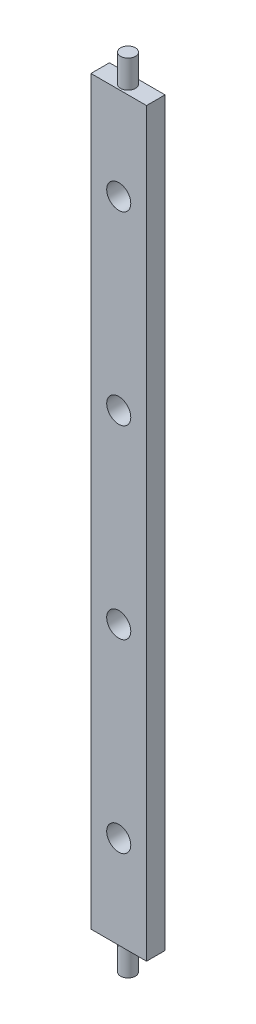
ISO-10303-21;
HEADER;
FILE_DESCRIPTION(('STEP AP214'),'2;1');
FILE_NAME('part.step','',(''),(''),'','','');
FILE_SCHEMA(('AUTOMOTIVE_DESIGN { 1 0 10303 214 1 1 1 1 }'));
ENDSEC;
DATA;
#1=APPLICATION_CONTEXT('core data for automotive mechanical design processes');
#2=APPLICATION_PROTOCOL_DEFINITION('international standard','automotive_design',2000,#1);
#3=PRODUCT_CONTEXT('',#1,'mechanical');
#4=PRODUCT('Part','Part','',(#3));
#5=PRODUCT_RELATED_PRODUCT_CATEGORY('part','',(#4));
#6=PRODUCT_DEFINITION_FORMATION('','',#4);
#7=PRODUCT_DEFINITION_CONTEXT('part definition',#1,'design');
#8=PRODUCT_DEFINITION('design','',#6,#7);
#9=PRODUCT_DEFINITION_SHAPE('','',#8);
#10=(LENGTH_UNIT() NAMED_UNIT(*) SI_UNIT(.MILLI.,.METRE.));
#11=(NAMED_UNIT(*) PLANE_ANGLE_UNIT() SI_UNIT($,.RADIAN.));
#12=(NAMED_UNIT(*) SI_UNIT($,.STERADIAN.) SOLID_ANGLE_UNIT());
#13=UNCERTAINTY_MEASURE_WITH_UNIT(LENGTH_MEASURE(1.E-05),#10,'distance_accuracy_value','');
#14=(GEOMETRIC_REPRESENTATION_CONTEXT(3) GLOBAL_UNCERTAINTY_ASSIGNED_CONTEXT((#13)) GLOBAL_UNIT_ASSIGNED_CONTEXT((#10,
#11,#12)) REPRESENTATION_CONTEXT('',''));
#15=CARTESIAN_POINT('',(0.,0.,0.));
#16=DIRECTION('',(0.,0.,1.));
#17=DIRECTION('',(1.,0.,0.));
#18=AXIS2_PLACEMENT_3D('',#15,#16,#17);
#19=CARTESIAN_POINT('',(3.,-40.,2.));
#20=DIRECTION('',(-1.,0.,0.));
#21=DIRECTION('',(0.,0.,1.));
#22=AXIS2_PLACEMENT_3D('',#19,#20,#21);
#23=PLANE('',#22);
#24=DIRECTION('',(0.,1.,0.));
#25=VECTOR('',#24,1.);
#26=CARTESIAN_POINT('',(3.,-40.,0.));
#27=LINE('',#26,#25);
#28=CARTESIAN_POINT('',(3.,-40.,0.));
#29=VERTEX_POINT('',#28);
#30=CARTESIAN_POINT('',(3.,40.,0.));
#31=VERTEX_POINT('',#30);
#32=EDGE_CURVE('E108',#29,#31,#27,.T.);
#33=ORIENTED_EDGE('',*,*,#32,.T.);
#34=DIRECTION('',(0.,0.,-1.));
#35=VECTOR('',#34,1.);
#36=CARTESIAN_POINT('',(3.,40.,2.));
#37=LINE('',#36,#35);
#38=CARTESIAN_POINT('',(3.,40.,2.));
#39=VERTEX_POINT('',#38);
#40=EDGE_CURVE('E99',#39,#31,#37,.T.);
#41=ORIENTED_EDGE('',*,*,#40,.F.);
#42=DIRECTION('',(0.,1.,0.));
#43=VECTOR('',#42,1.);
#44=CARTESIAN_POINT('',(3.,-40.,2.));
#45=LINE('',#44,#43);
#46=CARTESIAN_POINT('',(3.,-40.,2.));
#47=VERTEX_POINT('',#46);
#48=EDGE_CURVE('E93',#47,#39,#45,.T.);
#49=ORIENTED_EDGE('',*,*,#48,.F.);
#50=DIRECTION('',(0.,0.,-1.));
#51=VECTOR('',#50,1.);
#52=CARTESIAN_POINT('',(3.,-40.,2.));
#53=LINE('',#52,#51);
#54=EDGE_CURVE('E104',#47,#29,#53,.T.);
#55=ORIENTED_EDGE('',*,*,#54,.T.);
#56=EDGE_LOOP('',(#33,#41,#49,#55));
#57=FACE_BOUND('',#56,.T.);
#58=ADVANCED_FACE('F39',(#57),#23,.F.);
#59=CARTESIAN_POINT('',(-3.,40.,2.));
#60=DIRECTION('',(0.,-1.,0.));
#61=DIRECTION('',(0.,0.,-1.));
#62=AXIS2_PLACEMENT_3D('',#59,#60,#61);
#63=PLANE('',#62);
#64=CARTESIAN_POINT('',(0.,40.,1.));
#65=DIRECTION('',(0.,1.,0.));
#66=DIRECTION('',(0.,0.,1.));
#67=AXIS2_PLACEMENT_3D('',#64,#65,#66);
#68=CIRCLE('',#67,0.8);
#69=CARTESIAN_POINT('',(0.,40.,1.8));
#70=VERTEX_POINT('',#69);
#71=EDGE_CURVE('E48',#70,#70,#68,.T.);
#72=ORIENTED_EDGE('',*,*,#71,.F.);
#73=EDGE_LOOP('',(#72));
#74=FACE_BOUND('',#73,.T.);
#75=DIRECTION('',(-1.,0.,0.));
#76=VECTOR('',#75,1.);
#77=CARTESIAN_POINT('',(-3.,40.,0.));
#78=LINE('',#77,#76);
#79=CARTESIAN_POINT('',(-3.,40.,0.));
#80=VERTEX_POINT('',#79);
#81=EDGE_CURVE('E98',#31,#80,#78,.T.);
#82=ORIENTED_EDGE('',*,*,#81,.T.);
#83=DIRECTION('',(0.,0.,-1.));
#84=VECTOR('',#83,1.);
#85=CARTESIAN_POINT('',(-3.,40.,2.));
#86=LINE('',#85,#84);
#87=CARTESIAN_POINT('',(-3.,40.,2.));
#88=VERTEX_POINT('',#87);
#89=EDGE_CURVE('E96',#88,#80,#86,.T.);
#90=ORIENTED_EDGE('',*,*,#89,.F.);
#91=DIRECTION('',(-1.,0.,0.));
#92=VECTOR('',#91,1.);
#93=CARTESIAN_POINT('',(-3.,40.,2.));
#94=LINE('',#93,#92);
#95=EDGE_CURVE('E88',#39,#88,#94,.T.);
#96=ORIENTED_EDGE('',*,*,#95,.F.);
#97=ORIENTED_EDGE('',*,*,#40,.T.);
#98=EDGE_LOOP('',(#82,#90,#96,#97));
#99=FACE_BOUND('',#98,.T.);
#100=ADVANCED_FACE('F97',(#74,#99),#63,.F.);
#101=CARTESIAN_POINT('',(-3.,-40.,2.));
#102=DIRECTION('',(1.,0.,0.));
#103=DIRECTION('',(0.,0.,-1.));
#104=AXIS2_PLACEMENT_3D('',#101,#102,#103);
#105=PLANE('',#104);
#106=DIRECTION('',(0.,-1.,0.));
#107=VECTOR('',#106,1.);
#108=CARTESIAN_POINT('',(-3.,-40.,0.));
#109=LINE('',#108,#107);
#110=CARTESIAN_POINT('',(-3.,-40.,0.));
#111=VERTEX_POINT('',#110);
#112=EDGE_CURVE('E74',#80,#111,#109,.T.);
#113=ORIENTED_EDGE('',*,*,#112,.T.);
#114=DIRECTION('',(0.,0.,-1.));
#115=VECTOR('',#114,1.);
#116=CARTESIAN_POINT('',(-3.,-40.,2.));
#117=LINE('',#116,#115);
#118=CARTESIAN_POINT('',(-3.,-40.,2.));
#119=VERTEX_POINT('',#118);
#120=EDGE_CURVE('E100',#119,#111,#117,.T.);
#121=ORIENTED_EDGE('',*,*,#120,.F.);
#122=DIRECTION('',(0.,-1.,0.));
#123=VECTOR('',#122,1.);
#124=CARTESIAN_POINT('',(-3.,-40.,2.));
#125=LINE('',#124,#123);
#126=EDGE_CURVE('E91',#88,#119,#125,.T.);
#127=ORIENTED_EDGE('',*,*,#126,.F.);
#128=ORIENTED_EDGE('',*,*,#89,.T.);
#129=EDGE_LOOP('',(#113,#121,#127,#128));
#130=FACE_BOUND('',#129,.T.);
#131=ADVANCED_FACE('F102',(#130),#105,.F.);
#132=CARTESIAN_POINT('',(-3.,-40.,2.));
#133=DIRECTION('',(0.,1.,0.));
#134=DIRECTION('',(0.,0.,1.));
#135=AXIS2_PLACEMENT_3D('',#132,#133,#134);
#136=PLANE('',#135);
#137=CARTESIAN_POINT('',(0.,-40.,1.));
#138=DIRECTION('',(0.,-1.,0.));
#139=DIRECTION('',(0.,0.,-1.));
#140=AXIS2_PLACEMENT_3D('',#137,#138,#139);
#141=CIRCLE('',#140,0.8);
#142=CARTESIAN_POINT('',(0.,-40.,0.2));
#143=VERTEX_POINT('',#142);
#144=EDGE_CURVE('E11',#143,#143,#141,.T.);
#145=ORIENTED_EDGE('',*,*,#144,.F.);
#146=EDGE_LOOP('',(#145));
#147=FACE_BOUND('',#146,.T.);
#148=DIRECTION('',(1.,0.,0.));
#149=VECTOR('',#148,1.);
#150=CARTESIAN_POINT('',(-3.,-40.,0.));
#151=LINE('',#150,#149);
#152=EDGE_CURVE('E80',#111,#29,#151,.T.);
#153=ORIENTED_EDGE('',*,*,#152,.T.);
#154=ORIENTED_EDGE('',*,*,#54,.F.);
#155=DIRECTION('',(1.,0.,0.));
#156=VECTOR('',#155,1.);
#157=CARTESIAN_POINT('',(-3.,-40.,2.));
#158=LINE('',#157,#156);
#159=EDGE_CURVE('E57',#119,#47,#158,.T.);
#160=ORIENTED_EDGE('',*,*,#159,.F.);
#161=ORIENTED_EDGE('',*,*,#120,.T.);
#162=EDGE_LOOP('',(#153,#154,#160,#161));
#163=FACE_BOUND('',#162,.T.);
#164=ADVANCED_FACE('F145',(#147,#163),#136,.F.);
#165=CARTESIAN_POINT('',(0.,0.,2.));
#166=DIRECTION('',(0.,0.,-1.));
#167=DIRECTION('',(-1.,0.,0.));
#168=AXIS2_PLACEMENT_3D('',#165,#166,#167);
#169=PLANE('',#168);
#170=CARTESIAN_POINT('',(0.,-30.,2.));
#171=DIRECTION('',(0.,0.,1.));
#172=DIRECTION('',(1.,0.,0.));
#173=AXIS2_PLACEMENT_3D('',#170,#171,#172);
#174=CIRCLE('',#173,1.3);
#175=CARTESIAN_POINT('',(1.3,-30.,2.));
#176=VERTEX_POINT('',#175);
#177=EDGE_CURVE('E121',#176,#176,#174,.T.);
#178=ORIENTED_EDGE('',*,*,#177,.F.);
#179=EDGE_LOOP('',(#178));
#180=FACE_BOUND('',#179,.T.);
#181=CARTESIAN_POINT('',(0.,-10.,2.));
#182=DIRECTION('',(0.,0.,1.));
#183=DIRECTION('',(1.,0.,0.));
#184=AXIS2_PLACEMENT_3D('',#181,#182,#183);
#185=CIRCLE('',#184,1.3);
#186=CARTESIAN_POINT('',(1.3,-10.,2.));
#187=VERTEX_POINT('',#186);
#188=EDGE_CURVE('E177',#187,#187,#185,.T.);
#189=ORIENTED_EDGE('',*,*,#188,.F.);
#190=EDGE_LOOP('',(#189));
#191=FACE_BOUND('',#190,.T.);
#192=CARTESIAN_POINT('',(0.,10.,2.));
#193=DIRECTION('',(0.,0.,1.));
#194=DIRECTION('',(1.,0.,0.));
#195=AXIS2_PLACEMENT_3D('',#192,#193,#194);
#196=CIRCLE('',#195,1.3);
#197=CARTESIAN_POINT('',(1.3,10.,2.));
#198=VERTEX_POINT('',#197);
#199=EDGE_CURVE('E180',#198,#198,#196,.T.);
#200=ORIENTED_EDGE('',*,*,#199,.F.);
#201=EDGE_LOOP('',(#200));
#202=FACE_BOUND('',#201,.T.);
#203=CARTESIAN_POINT('',(0.,30.,2.));
#204=DIRECTION('',(0.,0.,1.));
#205=DIRECTION('',(1.,0.,0.));
#206=AXIS2_PLACEMENT_3D('',#203,#204,#205);
#207=CIRCLE('',#206,1.3);
#208=CARTESIAN_POINT('',(1.3,30.,2.));
#209=VERTEX_POINT('',#208);
#210=EDGE_CURVE('E183',#209,#209,#207,.T.);
#211=ORIENTED_EDGE('',*,*,#210,.F.);
#212=EDGE_LOOP('',(#211));
#213=FACE_BOUND('',#212,.T.);
#214=ORIENTED_EDGE('',*,*,#48,.T.);
#215=ORIENTED_EDGE('',*,*,#95,.T.);
#216=ORIENTED_EDGE('',*,*,#126,.T.);
#217=ORIENTED_EDGE('',*,*,#159,.T.);
#218=EDGE_LOOP('',(#214,#215,#216,#217));
#219=FACE_BOUND('',#218,.T.);
#220=ADVANCED_FACE('F89',(#180,#191,#202,#213,#219),#169,.F.);
#221=CARTESIAN_POINT('',(0.,0.,0.));
#222=DIRECTION('',(0.,0.,-1.));
#223=DIRECTION('',(-1.,0.,0.));
#224=AXIS2_PLACEMENT_3D('',#221,#222,#223);
#225=PLANE('',#224);
#226=CARTESIAN_POINT('',(0.,-30.,0.));
#227=DIRECTION('',(0.,0.,-1.));
#228=DIRECTION('',(-1.,0.,0.));
#229=AXIS2_PLACEMENT_3D('',#226,#227,#228);
#230=CIRCLE('',#229,1.3);
#231=CARTESIAN_POINT('',(1.3,-30.,0.));
#232=VERTEX_POINT('',#231);
#233=EDGE_CURVE('E42',#232,#232,#230,.T.);
#234=ORIENTED_EDGE('',*,*,#233,.F.);
#235=EDGE_LOOP('',(#234));
#236=FACE_BOUND('',#235,.T.);
#237=CARTESIAN_POINT('',(0.,-10.,0.));
#238=DIRECTION('',(0.,0.,-1.));
#239=DIRECTION('',(-1.,0.,0.));
#240=AXIS2_PLACEMENT_3D('',#237,#238,#239);
#241=CIRCLE('',#240,1.3);
#242=CARTESIAN_POINT('',(1.3,-10.,0.));
#243=VERTEX_POINT('',#242);
#244=EDGE_CURVE('E123',#243,#243,#241,.T.);
#245=ORIENTED_EDGE('',*,*,#244,.F.);
#246=EDGE_LOOP('',(#245));
#247=FACE_BOUND('',#246,.T.);
#248=CARTESIAN_POINT('',(0.,10.,0.));
#249=DIRECTION('',(0.,0.,-1.));
#250=DIRECTION('',(-1.,0.,0.));
#251=AXIS2_PLACEMENT_3D('',#248,#249,#250);
#252=CIRCLE('',#251,1.3);
#253=CARTESIAN_POINT('',(1.3,10.,0.));
#254=VERTEX_POINT('',#253);
#255=EDGE_CURVE('E120',#254,#254,#252,.T.);
#256=ORIENTED_EDGE('',*,*,#255,.F.);
#257=EDGE_LOOP('',(#256));
#258=FACE_BOUND('',#257,.T.);
#259=CARTESIAN_POINT('',(0.,30.,0.));
#260=DIRECTION('',(0.,0.,-1.));
#261=DIRECTION('',(-1.,0.,0.));
#262=AXIS2_PLACEMENT_3D('',#259,#260,#261);
#263=CIRCLE('',#262,1.3);
#264=CARTESIAN_POINT('',(1.3,30.,0.));
#265=VERTEX_POINT('',#264);
#266=EDGE_CURVE('E117',#265,#265,#263,.T.);
#267=ORIENTED_EDGE('',*,*,#266,.F.);
#268=EDGE_LOOP('',(#267));
#269=FACE_BOUND('',#268,.T.);
#270=ORIENTED_EDGE('',*,*,#32,.F.);
#271=ORIENTED_EDGE('',*,*,#152,.F.);
#272=ORIENTED_EDGE('',*,*,#112,.F.);
#273=ORIENTED_EDGE('',*,*,#81,.F.);
#274=EDGE_LOOP('',(#270,#271,#272,#273));
#275=FACE_BOUND('',#274,.T.);
#276=ADVANCED_FACE('F133',(#236,#247,#258,#269,#275),#225,.T.);
#277=CARTESIAN_POINT('',(0.,30.,-1.2E-05));
#278=DIRECTION('',(0.,0.,1.));
#279=DIRECTION('',(1.,0.,0.));
#280=AXIS2_PLACEMENT_3D('',#277,#278,#279);
#281=CYLINDRICAL_SURFACE('',#280,1.3);
#282=CARTESIAN_POINT('',(1.3,30.,0.));
#283=CARTESIAN_POINT('',(1.3,30.,0.0208333333333333));
#284=CARTESIAN_POINT('',(1.3,30.,0.0416666666666667));
#285=CARTESIAN_POINT('',(1.3,30.,0.0833333333333333));
#286=CARTESIAN_POINT('',(1.3,30.,0.104166666666667));
#287=CARTESIAN_POINT('',(1.3,30.,0.145833333333333));
#288=CARTESIAN_POINT('',(1.3,30.,0.166666666666667));
#289=CARTESIAN_POINT('',(1.3,30.,0.208333333333333));
#290=CARTESIAN_POINT('',(1.3,30.,0.229166666666667));
#291=CARTESIAN_POINT('',(1.3,30.,0.270833333333333));
#292=CARTESIAN_POINT('',(1.3,30.,0.291666666666667));
#293=CARTESIAN_POINT('',(1.3,30.,0.333333333333333));
#294=CARTESIAN_POINT('',(1.3,30.,0.354166666666667));
#295=CARTESIAN_POINT('',(1.3,30.,0.395833333333333));
#296=CARTESIAN_POINT('',(1.3,30.,0.416666666666667));
#297=CARTESIAN_POINT('',(1.3,30.,0.458333333333333));
#298=CARTESIAN_POINT('',(1.3,30.,0.479166666666667));
#299=CARTESIAN_POINT('',(1.3,30.,0.520833333333333));
#300=CARTESIAN_POINT('',(1.3,30.,0.541666666666667));
#301=CARTESIAN_POINT('',(1.3,30.,0.583333333333333));
#302=CARTESIAN_POINT('',(1.3,30.,0.604166666666667));
#303=CARTESIAN_POINT('',(1.3,30.,0.645833333333333));
#304=CARTESIAN_POINT('',(1.3,30.,0.666666666666667));
#305=CARTESIAN_POINT('',(1.3,30.,0.708333333333333));
#306=CARTESIAN_POINT('',(1.3,30.,0.729166666666667));
#307=CARTESIAN_POINT('',(1.3,30.,0.770833333333333));
#308=CARTESIAN_POINT('',(1.3,30.,0.791666666666667));
#309=CARTESIAN_POINT('',(1.3,30.,0.833333333333333));
#310=CARTESIAN_POINT('',(1.3,30.,0.854166666666667));
#311=CARTESIAN_POINT('',(1.3,30.,0.895833333333333));
#312=CARTESIAN_POINT('',(1.3,30.,0.916666666666667));
#313=CARTESIAN_POINT('',(1.3,30.,0.958333333333333));
#314=CARTESIAN_POINT('',(1.3,30.,0.979166666666667));
#315=CARTESIAN_POINT('',(1.3,30.,1.02083333333333));
#316=CARTESIAN_POINT('',(1.3,30.,1.04166666666667));
#317=CARTESIAN_POINT('',(1.3,30.,1.08333333333333));
#318=CARTESIAN_POINT('',(1.3,30.,1.10416666666667));
#319=CARTESIAN_POINT('',(1.3,30.,1.14583333333333));
#320=CARTESIAN_POINT('',(1.3,30.,1.16666666666667));
#321=CARTESIAN_POINT('',(1.3,30.,1.20833333333333));
#322=CARTESIAN_POINT('',(1.3,30.,1.22916666666667));
#323=CARTESIAN_POINT('',(1.3,30.,1.27083333333333));
#324=CARTESIAN_POINT('',(1.3,30.,1.29166666666667));
#325=CARTESIAN_POINT('',(1.3,30.,1.33333333333333));
#326=CARTESIAN_POINT('',(1.3,30.,1.35416666666667));
#327=CARTESIAN_POINT('',(1.3,30.,1.39583333333333));
#328=CARTESIAN_POINT('',(1.3,30.,1.41666666666667));
#329=CARTESIAN_POINT('',(1.3,30.,1.45833333333333));
#330=CARTESIAN_POINT('',(1.3,30.,1.47916666666667));
#331=CARTESIAN_POINT('',(1.3,30.,1.52083333333333));
#332=CARTESIAN_POINT('',(1.3,30.,1.54166666666667));
#333=CARTESIAN_POINT('',(1.3,30.,1.58333333333333));
#334=CARTESIAN_POINT('',(1.3,30.,1.60416666666667));
#335=CARTESIAN_POINT('',(1.3,30.,1.64583333333333));
#336=CARTESIAN_POINT('',(1.3,30.,1.66666666666667));
#337=CARTESIAN_POINT('',(1.3,30.,1.70833333333333));
#338=CARTESIAN_POINT('',(1.3,30.,1.72916666666667));
#339=CARTESIAN_POINT('',(1.3,30.,1.77083333333333));
#340=CARTESIAN_POINT('',(1.3,30.,1.79166666666667));
#341=CARTESIAN_POINT('',(1.3,30.,1.83333333333333));
#342=CARTESIAN_POINT('',(1.3,30.,1.85416666666667));
#343=CARTESIAN_POINT('',(1.3,30.,1.89583333333333));
#344=CARTESIAN_POINT('',(1.3,30.,1.91666666666667));
#345=CARTESIAN_POINT('',(1.3,30.,1.95833333333333));
#346=CARTESIAN_POINT('',(1.3,30.,1.97916666666667));
#347=CARTESIAN_POINT('',(1.3,30.,2.));
#348=B_SPLINE_CURVE_WITH_KNOTS('',3,(#282,#283,#284,#285,#286,#287,#288,#289,#290,#291,#292,
#293,#294,#295,#296,#297,#298,#299,#300,#301,#302,#303,#304,#305,#306,#307,#308,#309,#310,#311,
#312,#313,#314,#315,#316,#317,#318,#319,#320,#321,#322,#323,#324,#325,#326,#327,#328,#329,#330,
#331,#332,#333,#334,#335,#336,#337,#338,#339,#340,#341,#342,#343,#344,#345,#346,#347),
.UNSPECIFIED.,.F.,.F.,(4,2,2,2,2,2,2,2,2,2,2,2,2,2,2,2,2,2,2,2,2,2,2,2,2,2,2,2,2,2,2,2,4),(0.,
0.0625,0.125,0.1875,0.25,0.3125,0.375,0.4375,0.5,0.5625,0.625,0.6875,0.75,0.8125,0.875,0.9375,
1.,1.0625,1.125,1.1875,1.25,1.3125,1.375,1.4375,1.5,1.5625,1.625,1.6875,1.75,1.8125,1.875,
1.9375,2.),.UNSPECIFIED.);
#349=EDGE_CURVE('BSEAM136',#265,#209,#348,.T.);
#350=ORIENTED_EDGE('',*,*,#266,.T.);
#351=ORIENTED_EDGE('',*,*,#210,.T.);
#352=ORIENTED_EDGE('',*,*,#349,.T.);
#353=ORIENTED_EDGE('',*,*,#349,.F.);
#354=EDGE_LOOP('',(#350,#352,#351,#353));
#355=FACE_BOUND('',#354,.T.);
#356=ADVANCED_FACE('F136',(#355),#281,.F.);
#357=CARTESIAN_POINT('',(0.,10.,-1.2E-05));
#358=DIRECTION('',(0.,0.,1.));
#359=DIRECTION('',(1.,0.,0.));
#360=AXIS2_PLACEMENT_3D('',#357,#358,#359);
#361=CYLINDRICAL_SURFACE('',#360,1.3);
#362=CARTESIAN_POINT('',(1.3,10.,0.));
#363=CARTESIAN_POINT('',(1.3,10.,0.0208333333333333));
#364=CARTESIAN_POINT('',(1.3,10.,0.0416666666666667));
#365=CARTESIAN_POINT('',(1.3,10.,0.0833333333333333));
#366=CARTESIAN_POINT('',(1.3,10.,0.104166666666667));
#367=CARTESIAN_POINT('',(1.3,10.,0.145833333333333));
#368=CARTESIAN_POINT('',(1.3,10.,0.166666666666667));
#369=CARTESIAN_POINT('',(1.3,10.,0.208333333333333));
#370=CARTESIAN_POINT('',(1.3,10.,0.229166666666667));
#371=CARTESIAN_POINT('',(1.3,10.,0.270833333333333));
#372=CARTESIAN_POINT('',(1.3,10.,0.291666666666667));
#373=CARTESIAN_POINT('',(1.3,10.,0.333333333333333));
#374=CARTESIAN_POINT('',(1.3,10.,0.354166666666667));
#375=CARTESIAN_POINT('',(1.3,10.,0.395833333333333));
#376=CARTESIAN_POINT('',(1.3,10.,0.416666666666667));
#377=CARTESIAN_POINT('',(1.3,10.,0.458333333333333));
#378=CARTESIAN_POINT('',(1.3,10.,0.479166666666667));
#379=CARTESIAN_POINT('',(1.3,10.,0.520833333333333));
#380=CARTESIAN_POINT('',(1.3,10.,0.541666666666667));
#381=CARTESIAN_POINT('',(1.3,10.,0.583333333333333));
#382=CARTESIAN_POINT('',(1.3,10.,0.604166666666667));
#383=CARTESIAN_POINT('',(1.3,10.,0.645833333333333));
#384=CARTESIAN_POINT('',(1.3,10.,0.666666666666667));
#385=CARTESIAN_POINT('',(1.3,10.,0.708333333333333));
#386=CARTESIAN_POINT('',(1.3,10.,0.729166666666667));
#387=CARTESIAN_POINT('',(1.3,10.,0.770833333333333));
#388=CARTESIAN_POINT('',(1.3,10.,0.791666666666667));
#389=CARTESIAN_POINT('',(1.3,10.,0.833333333333333));
#390=CARTESIAN_POINT('',(1.3,10.,0.854166666666667));
#391=CARTESIAN_POINT('',(1.3,10.,0.895833333333333));
#392=CARTESIAN_POINT('',(1.3,10.,0.916666666666667));
#393=CARTESIAN_POINT('',(1.3,10.,0.958333333333333));
#394=CARTESIAN_POINT('',(1.3,10.,0.979166666666667));
#395=CARTESIAN_POINT('',(1.3,10.,1.02083333333333));
#396=CARTESIAN_POINT('',(1.3,10.,1.04166666666667));
#397=CARTESIAN_POINT('',(1.3,10.,1.08333333333333));
#398=CARTESIAN_POINT('',(1.3,10.,1.10416666666667));
#399=CARTESIAN_POINT('',(1.3,10.,1.14583333333333));
#400=CARTESIAN_POINT('',(1.3,10.,1.16666666666667));
#401=CARTESIAN_POINT('',(1.3,10.,1.20833333333333));
#402=CARTESIAN_POINT('',(1.3,10.,1.22916666666667));
#403=CARTESIAN_POINT('',(1.3,10.,1.27083333333333));
#404=CARTESIAN_POINT('',(1.3,10.,1.29166666666667));
#405=CARTESIAN_POINT('',(1.3,10.,1.33333333333333));
#406=CARTESIAN_POINT('',(1.3,10.,1.35416666666667));
#407=CARTESIAN_POINT('',(1.3,10.,1.39583333333333));
#408=CARTESIAN_POINT('',(1.3,10.,1.41666666666667));
#409=CARTESIAN_POINT('',(1.3,10.,1.45833333333333));
#410=CARTESIAN_POINT('',(1.3,10.,1.47916666666667));
#411=CARTESIAN_POINT('',(1.3,10.,1.52083333333333));
#412=CARTESIAN_POINT('',(1.3,10.,1.54166666666667));
#413=CARTESIAN_POINT('',(1.3,10.,1.58333333333333));
#414=CARTESIAN_POINT('',(1.3,10.,1.60416666666667));
#415=CARTESIAN_POINT('',(1.3,10.,1.64583333333333));
#416=CARTESIAN_POINT('',(1.3,10.,1.66666666666667));
#417=CARTESIAN_POINT('',(1.3,10.,1.70833333333333));
#418=CARTESIAN_POINT('',(1.3,10.,1.72916666666667));
#419=CARTESIAN_POINT('',(1.3,10.,1.77083333333333));
#420=CARTESIAN_POINT('',(1.3,10.,1.79166666666667));
#421=CARTESIAN_POINT('',(1.3,10.,1.83333333333333));
#422=CARTESIAN_POINT('',(1.3,10.,1.85416666666667));
#423=CARTESIAN_POINT('',(1.3,10.,1.89583333333333));
#424=CARTESIAN_POINT('',(1.3,10.,1.91666666666667));
#425=CARTESIAN_POINT('',(1.3,10.,1.95833333333333));
#426=CARTESIAN_POINT('',(1.3,10.,1.97916666666667));
#427=CARTESIAN_POINT('',(1.3,10.,2.));
#428=B_SPLINE_CURVE_WITH_KNOTS('',3,(#362,#363,#364,#365,#366,#367,#368,#369,#370,#371,#372,
#373,#374,#375,#376,#377,#378,#379,#380,#381,#382,#383,#384,#385,#386,#387,#388,#389,#390,#391,
#392,#393,#394,#395,#396,#397,#398,#399,#400,#401,#402,#403,#404,#405,#406,#407,#408,#409,#410,
#411,#412,#413,#414,#415,#416,#417,#418,#419,#420,#421,#422,#423,#424,#425,#426,#427),
.UNSPECIFIED.,.F.,.F.,(4,2,2,2,2,2,2,2,2,2,2,2,2,2,2,2,2,2,2,2,2,2,2,2,2,2,2,2,2,2,2,2,4),(0.,
0.0625,0.125,0.1875,0.25,0.3125,0.375,0.4375,0.5,0.5625,0.625,0.6875,0.75,0.8125,0.875,0.9375,
1.,1.0625,1.125,1.1875,1.25,1.3125,1.375,1.4375,1.5,1.5625,1.625,1.6875,1.75,1.8125,1.875,
1.9375,2.),.UNSPECIFIED.);
#429=EDGE_CURVE('BSEAM214',#254,#198,#428,.T.);
#430=ORIENTED_EDGE('',*,*,#255,.T.);
#431=ORIENTED_EDGE('',*,*,#199,.T.);
#432=ORIENTED_EDGE('',*,*,#429,.T.);
#433=ORIENTED_EDGE('',*,*,#429,.F.);
#434=EDGE_LOOP('',(#430,#432,#431,#433));
#435=FACE_BOUND('',#434,.T.);
#436=ADVANCED_FACE('F214',(#435),#361,.F.);
#437=CARTESIAN_POINT('',(0.,-10.,-1.2E-05));
#438=DIRECTION('',(0.,0.,1.));
#439=DIRECTION('',(1.,0.,0.));
#440=AXIS2_PLACEMENT_3D('',#437,#438,#439);
#441=CYLINDRICAL_SURFACE('',#440,1.3);
#442=CARTESIAN_POINT('',(1.3,-10.,0.));
#443=CARTESIAN_POINT('',(1.3,-10.,0.0208333333333333));
#444=CARTESIAN_POINT('',(1.3,-10.,0.0416666666666667));
#445=CARTESIAN_POINT('',(1.3,-10.,0.0833333333333333));
#446=CARTESIAN_POINT('',(1.3,-10.,0.104166666666667));
#447=CARTESIAN_POINT('',(1.3,-10.,0.145833333333333));
#448=CARTESIAN_POINT('',(1.3,-10.,0.166666666666667));
#449=CARTESIAN_POINT('',(1.3,-10.,0.208333333333333));
#450=CARTESIAN_POINT('',(1.3,-10.,0.229166666666667));
#451=CARTESIAN_POINT('',(1.3,-10.,0.270833333333333));
#452=CARTESIAN_POINT('',(1.3,-10.,0.291666666666667));
#453=CARTESIAN_POINT('',(1.3,-10.,0.333333333333333));
#454=CARTESIAN_POINT('',(1.3,-10.,0.354166666666667));
#455=CARTESIAN_POINT('',(1.3,-10.,0.395833333333333));
#456=CARTESIAN_POINT('',(1.3,-10.,0.416666666666667));
#457=CARTESIAN_POINT('',(1.3,-10.,0.458333333333333));
#458=CARTESIAN_POINT('',(1.3,-10.,0.479166666666667));
#459=CARTESIAN_POINT('',(1.3,-10.,0.520833333333333));
#460=CARTESIAN_POINT('',(1.3,-10.,0.541666666666667));
#461=CARTESIAN_POINT('',(1.3,-10.,0.583333333333333));
#462=CARTESIAN_POINT('',(1.3,-10.,0.604166666666667));
#463=CARTESIAN_POINT('',(1.3,-10.,0.645833333333333));
#464=CARTESIAN_POINT('',(1.3,-10.,0.666666666666667));
#465=CARTESIAN_POINT('',(1.3,-10.,0.708333333333333));
#466=CARTESIAN_POINT('',(1.3,-10.,0.729166666666667));
#467=CARTESIAN_POINT('',(1.3,-10.,0.770833333333333));
#468=CARTESIAN_POINT('',(1.3,-10.,0.791666666666667));
#469=CARTESIAN_POINT('',(1.3,-10.,0.833333333333333));
#470=CARTESIAN_POINT('',(1.3,-10.,0.854166666666667));
#471=CARTESIAN_POINT('',(1.3,-10.,0.895833333333333));
#472=CARTESIAN_POINT('',(1.3,-10.,0.916666666666667));
#473=CARTESIAN_POINT('',(1.3,-10.,0.958333333333333));
#474=CARTESIAN_POINT('',(1.3,-10.,0.979166666666667));
#475=CARTESIAN_POINT('',(1.3,-10.,1.02083333333333));
#476=CARTESIAN_POINT('',(1.3,-10.,1.04166666666667));
#477=CARTESIAN_POINT('',(1.3,-10.,1.08333333333333));
#478=CARTESIAN_POINT('',(1.3,-10.,1.10416666666667));
#479=CARTESIAN_POINT('',(1.3,-10.,1.14583333333333));
#480=CARTESIAN_POINT('',(1.3,-10.,1.16666666666667));
#481=CARTESIAN_POINT('',(1.3,-10.,1.20833333333333));
#482=CARTESIAN_POINT('',(1.3,-10.,1.22916666666667));
#483=CARTESIAN_POINT('',(1.3,-10.,1.27083333333333));
#484=CARTESIAN_POINT('',(1.3,-10.,1.29166666666667));
#485=CARTESIAN_POINT('',(1.3,-10.,1.33333333333333));
#486=CARTESIAN_POINT('',(1.3,-10.,1.35416666666667));
#487=CARTESIAN_POINT('',(1.3,-10.,1.39583333333333));
#488=CARTESIAN_POINT('',(1.3,-10.,1.41666666666667));
#489=CARTESIAN_POINT('',(1.3,-10.,1.45833333333333));
#490=CARTESIAN_POINT('',(1.3,-10.,1.47916666666667));
#491=CARTESIAN_POINT('',(1.3,-10.,1.52083333333333));
#492=CARTESIAN_POINT('',(1.3,-10.,1.54166666666667));
#493=CARTESIAN_POINT('',(1.3,-10.,1.58333333333333));
#494=CARTESIAN_POINT('',(1.3,-10.,1.60416666666667));
#495=CARTESIAN_POINT('',(1.3,-10.,1.64583333333333));
#496=CARTESIAN_POINT('',(1.3,-10.,1.66666666666667));
#497=CARTESIAN_POINT('',(1.3,-10.,1.70833333333333));
#498=CARTESIAN_POINT('',(1.3,-10.,1.72916666666667));
#499=CARTESIAN_POINT('',(1.3,-10.,1.77083333333333));
#500=CARTESIAN_POINT('',(1.3,-10.,1.79166666666667));
#501=CARTESIAN_POINT('',(1.3,-10.,1.83333333333333));
#502=CARTESIAN_POINT('',(1.3,-10.,1.85416666666667));
#503=CARTESIAN_POINT('',(1.3,-10.,1.89583333333333));
#504=CARTESIAN_POINT('',(1.3,-10.,1.91666666666667));
#505=CARTESIAN_POINT('',(1.3,-10.,1.95833333333333));
#506=CARTESIAN_POINT('',(1.3,-10.,1.97916666666667));
#507=CARTESIAN_POINT('',(1.3,-10.,2.));
#508=B_SPLINE_CURVE_WITH_KNOTS('',3,(#442,#443,#444,#445,#446,#447,#448,#449,#450,#451,#452,
#453,#454,#455,#456,#457,#458,#459,#460,#461,#462,#463,#464,#465,#466,#467,#468,#469,#470,#471,
#472,#473,#474,#475,#476,#477,#478,#479,#480,#481,#482,#483,#484,#485,#486,#487,#488,#489,#490,
#491,#492,#493,#494,#495,#496,#497,#498,#499,#500,#501,#502,#503,#504,#505,#506,#507),
.UNSPECIFIED.,.F.,.F.,(4,2,2,2,2,2,2,2,2,2,2,2,2,2,2,2,2,2,2,2,2,2,2,2,2,2,2,2,2,2,2,2,4),(0.,
0.0625,0.125,0.1875,0.25,0.3125,0.375,0.4375,0.5,0.5625,0.625,0.6875,0.75,0.8125,0.875,0.9375,
1.,1.0625,1.125,1.1875,1.25,1.3125,1.375,1.4375,1.5,1.5625,1.625,1.6875,1.75,1.8125,1.875,
1.9375,2.),.UNSPECIFIED.);
#509=EDGE_CURVE('BSEAM211',#243,#187,#508,.T.);
#510=ORIENTED_EDGE('',*,*,#244,.T.);
#511=ORIENTED_EDGE('',*,*,#188,.T.);
#512=ORIENTED_EDGE('',*,*,#509,.T.);
#513=ORIENTED_EDGE('',*,*,#509,.F.);
#514=EDGE_LOOP('',(#510,#512,#511,#513));
#515=FACE_BOUND('',#514,.T.);
#516=ADVANCED_FACE('F211',(#515),#441,.F.);
#517=CARTESIAN_POINT('',(0.,-30.,-1.2E-05));
#518=DIRECTION('',(0.,0.,1.));
#519=DIRECTION('',(1.,0.,0.));
#520=AXIS2_PLACEMENT_3D('',#517,#518,#519);
#521=CYLINDRICAL_SURFACE('',#520,1.3);
#522=CARTESIAN_POINT('',(1.3,-30.,0.));
#523=CARTESIAN_POINT('',(1.3,-30.,0.0208333333333333));
#524=CARTESIAN_POINT('',(1.3,-30.,0.0416666666666667));
#525=CARTESIAN_POINT('',(1.3,-30.,0.0833333333333333));
#526=CARTESIAN_POINT('',(1.3,-30.,0.104166666666667));
#527=CARTESIAN_POINT('',(1.3,-30.,0.145833333333333));
#528=CARTESIAN_POINT('',(1.3,-30.,0.166666666666667));
#529=CARTESIAN_POINT('',(1.3,-30.,0.208333333333333));
#530=CARTESIAN_POINT('',(1.3,-30.,0.229166666666667));
#531=CARTESIAN_POINT('',(1.3,-30.,0.270833333333333));
#532=CARTESIAN_POINT('',(1.3,-30.,0.291666666666667));
#533=CARTESIAN_POINT('',(1.3,-30.,0.333333333333333));
#534=CARTESIAN_POINT('',(1.3,-30.,0.354166666666667));
#535=CARTESIAN_POINT('',(1.3,-30.,0.395833333333333));
#536=CARTESIAN_POINT('',(1.3,-30.,0.416666666666667));
#537=CARTESIAN_POINT('',(1.3,-30.,0.458333333333333));
#538=CARTESIAN_POINT('',(1.3,-30.,0.479166666666667));
#539=CARTESIAN_POINT('',(1.3,-30.,0.520833333333333));
#540=CARTESIAN_POINT('',(1.3,-30.,0.541666666666667));
#541=CARTESIAN_POINT('',(1.3,-30.,0.583333333333333));
#542=CARTESIAN_POINT('',(1.3,-30.,0.604166666666667));
#543=CARTESIAN_POINT('',(1.3,-30.,0.645833333333333));
#544=CARTESIAN_POINT('',(1.3,-30.,0.666666666666667));
#545=CARTESIAN_POINT('',(1.3,-30.,0.708333333333333));
#546=CARTESIAN_POINT('',(1.3,-30.,0.729166666666667));
#547=CARTESIAN_POINT('',(1.3,-30.,0.770833333333333));
#548=CARTESIAN_POINT('',(1.3,-30.,0.791666666666667));
#549=CARTESIAN_POINT('',(1.3,-30.,0.833333333333333));
#550=CARTESIAN_POINT('',(1.3,-30.,0.854166666666667));
#551=CARTESIAN_POINT('',(1.3,-30.,0.895833333333333));
#552=CARTESIAN_POINT('',(1.3,-30.,0.916666666666667));
#553=CARTESIAN_POINT('',(1.3,-30.,0.958333333333333));
#554=CARTESIAN_POINT('',(1.3,-30.,0.979166666666667));
#555=CARTESIAN_POINT('',(1.3,-30.,1.02083333333333));
#556=CARTESIAN_POINT('',(1.3,-30.,1.04166666666667));
#557=CARTESIAN_POINT('',(1.3,-30.,1.08333333333333));
#558=CARTESIAN_POINT('',(1.3,-30.,1.10416666666667));
#559=CARTESIAN_POINT('',(1.3,-30.,1.14583333333333));
#560=CARTESIAN_POINT('',(1.3,-30.,1.16666666666667));
#561=CARTESIAN_POINT('',(1.3,-30.,1.20833333333333));
#562=CARTESIAN_POINT('',(1.3,-30.,1.22916666666667));
#563=CARTESIAN_POINT('',(1.3,-30.,1.27083333333333));
#564=CARTESIAN_POINT('',(1.3,-30.,1.29166666666667));
#565=CARTESIAN_POINT('',(1.3,-30.,1.33333333333333));
#566=CARTESIAN_POINT('',(1.3,-30.,1.35416666666667));
#567=CARTESIAN_POINT('',(1.3,-30.,1.39583333333333));
#568=CARTESIAN_POINT('',(1.3,-30.,1.41666666666667));
#569=CARTESIAN_POINT('',(1.3,-30.,1.45833333333333));
#570=CARTESIAN_POINT('',(1.3,-30.,1.47916666666667));
#571=CARTESIAN_POINT('',(1.3,-30.,1.52083333333333));
#572=CARTESIAN_POINT('',(1.3,-30.,1.54166666666667));
#573=CARTESIAN_POINT('',(1.3,-30.,1.58333333333333));
#574=CARTESIAN_POINT('',(1.3,-30.,1.60416666666667));
#575=CARTESIAN_POINT('',(1.3,-30.,1.64583333333333));
#576=CARTESIAN_POINT('',(1.3,-30.,1.66666666666667));
#577=CARTESIAN_POINT('',(1.3,-30.,1.70833333333333));
#578=CARTESIAN_POINT('',(1.3,-30.,1.72916666666667));
#579=CARTESIAN_POINT('',(1.3,-30.,1.77083333333333));
#580=CARTESIAN_POINT('',(1.3,-30.,1.79166666666667));
#581=CARTESIAN_POINT('',(1.3,-30.,1.83333333333333));
#582=CARTESIAN_POINT('',(1.3,-30.,1.85416666666667));
#583=CARTESIAN_POINT('',(1.3,-30.,1.89583333333333));
#584=CARTESIAN_POINT('',(1.3,-30.,1.91666666666667));
#585=CARTESIAN_POINT('',(1.3,-30.,1.95833333333333));
#586=CARTESIAN_POINT('',(1.3,-30.,1.97916666666667));
#587=CARTESIAN_POINT('',(1.3,-30.,2.));
#588=B_SPLINE_CURVE_WITH_KNOTS('',3,(#522,#523,#524,#525,#526,#527,#528,#529,#530,#531,#532,
#533,#534,#535,#536,#537,#538,#539,#540,#541,#542,#543,#544,#545,#546,#547,#548,#549,#550,#551,
#552,#553,#554,#555,#556,#557,#558,#559,#560,#561,#562,#563,#564,#565,#566,#567,#568,#569,#570,
#571,#572,#573,#574,#575,#576,#577,#578,#579,#580,#581,#582,#583,#584,#585,#586,#587),
.UNSPECIFIED.,.F.,.F.,(4,2,2,2,2,2,2,2,2,2,2,2,2,2,2,2,2,2,2,2,2,2,2,2,2,2,2,2,2,2,2,2,4),(0.,
0.0625,0.125,0.1875,0.25,0.3125,0.375,0.4375,0.5,0.5625,0.625,0.6875,0.75,0.8125,0.875,0.9375,
1.,1.0625,1.125,1.1875,1.25,1.3125,1.375,1.4375,1.5,1.5625,1.625,1.6875,1.75,1.8125,1.875,
1.9375,2.),.UNSPECIFIED.);
#589=EDGE_CURVE('BSEAM130',#232,#176,#588,.T.);
#590=ORIENTED_EDGE('',*,*,#233,.T.);
#591=ORIENTED_EDGE('',*,*,#177,.T.);
#592=ORIENTED_EDGE('',*,*,#589,.T.);
#593=ORIENTED_EDGE('',*,*,#589,.F.);
#594=EDGE_LOOP('',(#590,#592,#591,#593));
#595=FACE_BOUND('',#594,.T.);
#596=ADVANCED_FACE('F130',(#595),#521,.F.);
#597=CARTESIAN_POINT('',(0.,43.,1.));
#598=DIRECTION('',(0.,-1.,0.));
#599=DIRECTION('',(0.,0.,-1.));
#600=AXIS2_PLACEMENT_3D('',#597,#598,#599);
#601=CYLINDRICAL_SURFACE('',#600,0.8);
#602=CARTESIAN_POINT('',(0.,43.,1.));
#603=DIRECTION('',(0.,1.,0.));
#604=DIRECTION('',(0.,0.,1.));
#605=AXIS2_PLACEMENT_3D('',#602,#603,#604);
#606=CIRCLE('',#605,0.8);
#607=CARTESIAN_POINT('',(0.,43.,1.8));
#608=VERTEX_POINT('',#607);
#609=EDGE_CURVE('E174',#608,#608,#606,.T.);
#610=ORIENTED_EDGE('',*,*,#609,.F.);
#611=EDGE_LOOP('',(#610));
#612=FACE_BOUND('',#611,.T.);
#613=ORIENTED_EDGE('',*,*,#71,.T.);
#614=EDGE_LOOP('',(#613));
#615=FACE_BOUND('',#614,.T.);
#616=ADVANCED_FACE('F205',(#612,#615),#601,.T.);
#617=CARTESIAN_POINT('',(0.,43.,1.));
#618=DIRECTION('',(0.,1.,0.));
#619=DIRECTION('',(0.,0.,1.));
#620=AXIS2_PLACEMENT_3D('',#617,#618,#619);
#621=PLANE('',#620);
#622=ORIENTED_EDGE('',*,*,#609,.T.);
#623=EDGE_LOOP('',(#622));
#624=FACE_BOUND('',#623,.T.);
#625=ADVANCED_FACE('F199',(#624),#621,.T.);
#626=CARTESIAN_POINT('',(0.,-43.,1.));
#627=DIRECTION('',(0.,1.,0.));
#628=DIRECTION('',(0.,0.,1.));
#629=AXIS2_PLACEMENT_3D('',#626,#627,#628);
#630=CYLINDRICAL_SURFACE('',#629,0.8);
#631=CARTESIAN_POINT('',(0.,-43.,1.));
#632=DIRECTION('',(0.,-1.,0.));
#633=DIRECTION('',(0.,0.,-1.));
#634=AXIS2_PLACEMENT_3D('',#631,#632,#633);
#635=CIRCLE('',#634,0.8);
#636=CARTESIAN_POINT('',(0.,-43.,0.2));
#637=VERTEX_POINT('',#636);
#638=EDGE_CURVE('E188',#637,#637,#635,.T.);
#639=ORIENTED_EDGE('',*,*,#638,.F.);
#640=EDGE_LOOP('',(#639));
#641=FACE_BOUND('',#640,.T.);
#642=ORIENTED_EDGE('',*,*,#144,.T.);
#643=EDGE_LOOP('',(#642));
#644=FACE_BOUND('',#643,.T.);
#645=ADVANCED_FACE('F197',(#641,#644),#630,.T.);
#646=CARTESIAN_POINT('',(0.,-43.,1.));
#647=DIRECTION('',(0.,-1.,0.));
#648=DIRECTION('',(0.,0.,-1.));
#649=AXIS2_PLACEMENT_3D('',#646,#647,#648);
#650=PLANE('',#649);
#651=ORIENTED_EDGE('',*,*,#638,.T.);
#652=EDGE_LOOP('',(#651));
#653=FACE_BOUND('',#652,.T.);
#654=ADVANCED_FACE('F195',(#653),#650,.T.);
#655=CLOSED_SHELL('',(#58,#100,#131,#164,#220,#276,#356,#436,#516,#596,#616,#625,#645,#654));
#656=MANIFOLD_SOLID_BREP('B2',#655);
#657=ADVANCED_BREP_SHAPE_REPRESENTATION('',(#18,#656),#14);
#658=SHAPE_DEFINITION_REPRESENTATION(#9,#657);
ENDSEC;
END-ISO-10303-21;
